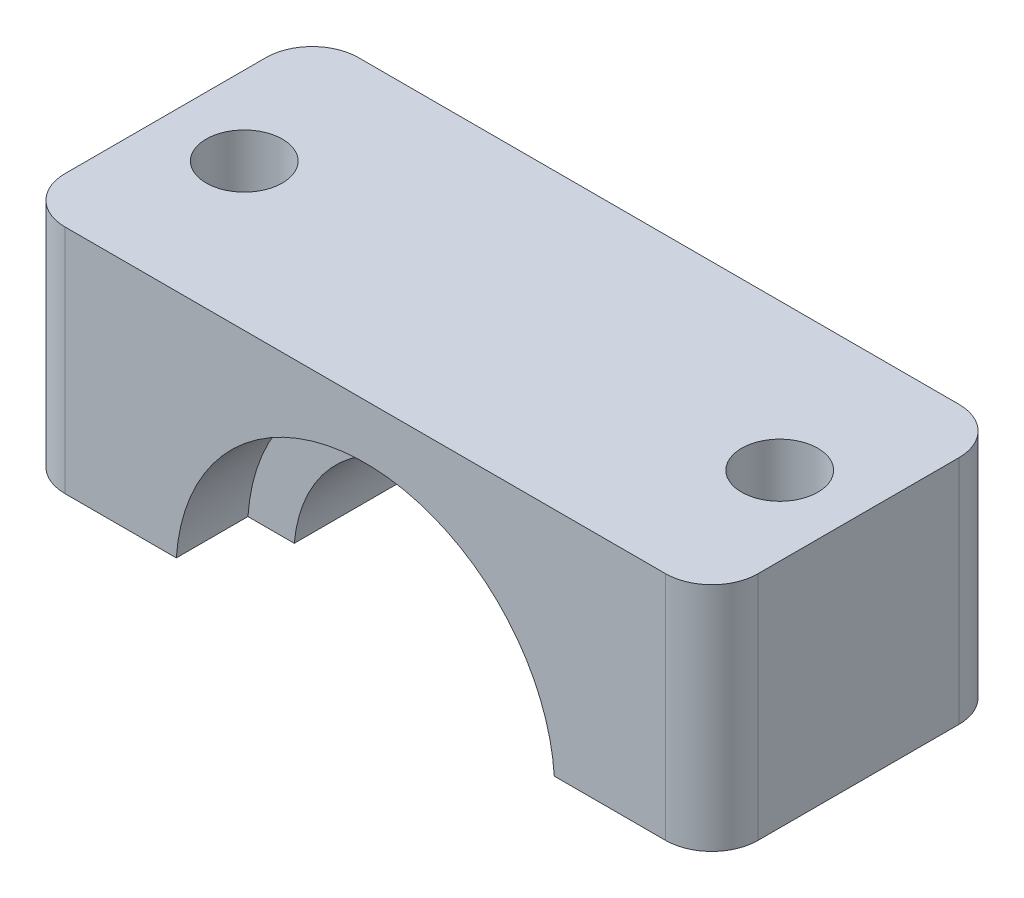
ISO-10303-21;
HEADER;
FILE_DESCRIPTION(('STEP AP214'),'2;1');
FILE_NAME('part.step','',(''),(''),'','','');
FILE_SCHEMA(('AUTOMOTIVE_DESIGN { 1 0 10303 214 1 1 1 1 }'));
ENDSEC;
DATA;
#1=APPLICATION_CONTEXT('core data for automotive mechanical design processes');
#2=APPLICATION_PROTOCOL_DEFINITION('international standard','automotive_design',2000,#1);
#3=PRODUCT_CONTEXT('',#1,'mechanical');
#4=PRODUCT('Part','Part','',(#3));
#5=PRODUCT_RELATED_PRODUCT_CATEGORY('part','',(#4));
#6=PRODUCT_DEFINITION_FORMATION('','',#4);
#7=PRODUCT_DEFINITION_CONTEXT('part definition',#1,'design');
#8=PRODUCT_DEFINITION('design','',#6,#7);
#9=PRODUCT_DEFINITION_SHAPE('','',#8);
#10=(LENGTH_UNIT() NAMED_UNIT(*) SI_UNIT(.MILLI.,.METRE.));
#11=(NAMED_UNIT(*) PLANE_ANGLE_UNIT() SI_UNIT($,.RADIAN.));
#12=(NAMED_UNIT(*) SI_UNIT($,.STERADIAN.) SOLID_ANGLE_UNIT());
#13=UNCERTAINTY_MEASURE_WITH_UNIT(LENGTH_MEASURE(1.E-05),#10,'distance_accuracy_value','');
#14=(GEOMETRIC_REPRESENTATION_CONTEXT(3) GLOBAL_UNCERTAINTY_ASSIGNED_CONTEXT((#13)) GLOBAL_UNIT_ASSIGNED_CONTEXT((#10,
#11,#12)) REPRESENTATION_CONTEXT('',''));
#15=CARTESIAN_POINT('',(0.,0.,0.));
#16=DIRECTION('',(0.,0.,1.));
#17=DIRECTION('',(1.,0.,0.));
#18=AXIS2_PLACEMENT_3D('',#15,#16,#17);
#19=CARTESIAN_POINT('',(0.,0.,0.));
#20=DIRECTION('',(0.,-1.,0.));
#21=DIRECTION('',(0.,0.,-1.));
#22=AXIS2_PLACEMENT_3D('',#19,#20,#21);
#23=PLANE('',#22);
#24=CARTESIAN_POINT('',(11.5907670429883,0.,0.));
#25=DIRECTION('',(0.,-1.,0.));
#26=DIRECTION('',(0.,0.,-1.));
#27=AXIS2_PLACEMENT_3D('',#24,#25,#26);
#28=CIRCLE('',#27,1.65);
#29=CARTESIAN_POINT('',(11.5907670429883,0.,-1.65));
#30=VERTEX_POINT('',#29);
#31=EDGE_CURVE('E314',#30,#30,#28,.F.);
#32=ORIENTED_EDGE('',*,*,#31,.T.);
#33=EDGE_LOOP('',(#32));
#34=FACE_BOUND('',#33,.T.);
#35=DIRECTION('',(-1.,0.,0.));
#36=VECTOR('',#35,1.);
#37=CARTESIAN_POINT('',(-15.,0.,-6.35));
#38=LINE('',#37,#36);
#39=CARTESIAN_POINT('',(13.,0.,-6.35));
#40=VERTEX_POINT('',#39);
#41=CARTESIAN_POINT('',(8.18153408597701,0.,-6.35));
#42=VERTEX_POINT('',#41);
#43=EDGE_CURVE('E214',#40,#42,#38,.T.);
#44=ORIENTED_EDGE('',*,*,#43,.F.);
#45=CARTESIAN_POINT('',(13.,0.,-4.35));
#46=DIRECTION('',(0.,-1.,0.));
#47=DIRECTION('',(0.,0.,-1.));
#48=AXIS2_PLACEMENT_3D('',#45,#46,#47);
#49=CIRCLE('',#48,2.);
#50=CARTESIAN_POINT('',(15.,0.,-4.35));
#51=VERTEX_POINT('',#50);
#52=EDGE_CURVE('E181',#40,#51,#49,.T.);
#53=ORIENTED_EDGE('',*,*,#52,.T.);
#54=DIRECTION('',(0.,0.,-1.));
#55=VECTOR('',#54,1.);
#56=CARTESIAN_POINT('',(15.,0.,6.35));
#57=LINE('',#56,#55);
#58=CARTESIAN_POINT('',(15.,0.,4.35));
#59=VERTEX_POINT('',#58);
#60=EDGE_CURVE('E241',#59,#51,#57,.T.);
#61=ORIENTED_EDGE('',*,*,#60,.F.);
#62=CARTESIAN_POINT('',(13.,0.,4.35));
#63=DIRECTION('',(0.,-1.,0.));
#64=DIRECTION('',(0.,0.,-1.));
#65=AXIS2_PLACEMENT_3D('',#62,#63,#64);
#66=CIRCLE('',#65,2.);
#67=CARTESIAN_POINT('',(13.,0.,6.35));
#68=VERTEX_POINT('',#67);
#69=EDGE_CURVE('E179',#59,#68,#66,.T.);
#70=ORIENTED_EDGE('',*,*,#69,.T.);
#71=DIRECTION('',(1.,0.,0.));
#72=VECTOR('',#71,1.);
#73=CARTESIAN_POINT('',(-15.,0.,6.35));
#74=LINE('',#73,#72);
#75=CARTESIAN_POINT('',(8.18153408597701,0.,6.35));
#76=VERTEX_POINT('',#75);
#77=EDGE_CURVE('E213',#76,#68,#74,.T.);
#78=ORIENTED_EDGE('',*,*,#77,.F.);
#79=DIRECTION('',(0.,0.,1.));
#80=VECTOR('',#79,1.);
#81=CARTESIAN_POINT('',(8.18153408597701,0.,3.25));
#82=LINE('',#81,#80);
#83=CARTESIAN_POINT('',(8.18153408597701,0.,3.25));
#84=VERTEX_POINT('',#83);
#85=EDGE_CURVE('E151',#84,#76,#82,.T.);
#86=ORIENTED_EDGE('',*,*,#85,.F.);
#87=DIRECTION('',(-1.,0.,0.));
#88=VECTOR('',#87,1.);
#89=CARTESIAN_POINT('',(0.,0.,3.25));
#90=LINE('',#89,#88);
#91=CARTESIAN_POINT('',(6.17555665507186,0.,3.25));
#92=VERTEX_POINT('',#91);
#93=EDGE_CURVE('E165',#84,#92,#90,.T.);
#94=ORIENTED_EDGE('',*,*,#93,.T.);
#95=DIRECTION('',(0.,0.,1.));
#96=VECTOR('',#95,1.);
#97=CARTESIAN_POINT('',(6.17555665507186,0.,-6.35));
#98=LINE('',#97,#96);
#99=CARTESIAN_POINT('',(6.17555665507186,0.,-2.55));
#100=VERTEX_POINT('',#99);
#101=EDGE_CURVE('E146',#100,#92,#98,.T.);
#102=ORIENTED_EDGE('',*,*,#101,.F.);
#103=DIRECTION('',(1.,0.,0.));
#104=VECTOR('',#103,1.);
#105=CARTESIAN_POINT('',(0.,0.,-2.55));
#106=LINE('',#105,#104);
#107=CARTESIAN_POINT('',(8.18153408597701,0.,-2.55));
#108=VERTEX_POINT('',#107);
#109=EDGE_CURVE('E224',#100,#108,#106,.T.);
#110=ORIENTED_EDGE('',*,*,#109,.T.);
#111=DIRECTION('',(0.,0.,-1.));
#112=VECTOR('',#111,1.);
#113=CARTESIAN_POINT('',(8.18153408597701,0.,-2.55));
#114=LINE('',#113,#112);
#115=EDGE_CURVE('E169',#42,#108,#114,.F.);
#116=ORIENTED_EDGE('',*,*,#115,.F.);
#117=EDGE_LOOP('',(#44,#53,#61,#70,#78,#86,#94,#102,#110,#116));
#118=FACE_BOUND('',#117,.T.);
#119=ADVANCED_FACE('F38',(#34,#118),#23,.T.);
#120=CARTESIAN_POINT('',(15.,10.,6.35));
#121=DIRECTION('',(-1.,0.,0.));
#122=DIRECTION('',(0.,0.,1.));
#123=AXIS2_PLACEMENT_3D('',#120,#121,#122);
#124=PLANE('',#123);
#125=ORIENTED_EDGE('',*,*,#60,.T.);
#126=DIRECTION('',(0.,-1.,0.));
#127=VECTOR('',#126,1.);
#128=CARTESIAN_POINT('',(15.,10.,-4.35));
#129=LINE('',#128,#127);
#130=CARTESIAN_POINT('',(15.,10.,-4.35));
#131=VERTEX_POINT('',#130);
#132=EDGE_CURVE('E186',#51,#131,#129,.F.);
#133=ORIENTED_EDGE('',*,*,#132,.T.);
#134=DIRECTION('',(0.,0.,-1.));
#135=VECTOR('',#134,1.);
#136=CARTESIAN_POINT('',(15.,10.,6.35));
#137=LINE('',#136,#135);
#138=CARTESIAN_POINT('',(15.,10.,4.35));
#139=VERTEX_POINT('',#138);
#140=EDGE_CURVE('E223',#139,#131,#137,.T.);
#141=ORIENTED_EDGE('',*,*,#140,.F.);
#142=DIRECTION('',(0.,-1.,0.));
#143=VECTOR('',#142,1.);
#144=CARTESIAN_POINT('',(15.,10.,4.35));
#145=LINE('',#144,#143);
#146=EDGE_CURVE('E183',#139,#59,#145,.T.);
#147=ORIENTED_EDGE('',*,*,#146,.T.);
#148=EDGE_LOOP('',(#125,#133,#141,#147));
#149=FACE_BOUND('',#148,.T.);
#150=ADVANCED_FACE('F270',(#149),#124,.F.);
#151=CARTESIAN_POINT('',(-15.,10.,-6.35));
#152=DIRECTION('',(0.,0.,1.));
#153=DIRECTION('',(1.,0.,0.));
#154=AXIS2_PLACEMENT_3D('',#151,#152,#153);
#155=PLANE('',#154);
#156=DIRECTION('',(-1.,0.,0.));
#157=VECTOR('',#156,1.);
#158=CARTESIAN_POINT('',(-15.,10.,-6.35));
#159=LINE('',#158,#157);
#160=CARTESIAN_POINT('',(13.,10.,-6.35));
#161=VERTEX_POINT('',#160);
#162=CARTESIAN_POINT('',(-13.,10.,-6.35));
#163=VERTEX_POINT('',#162);
#164=EDGE_CURVE('E251',#161,#163,#159,.T.);
#165=ORIENTED_EDGE('',*,*,#164,.F.);
#166=DIRECTION('',(0.,-1.,0.));
#167=VECTOR('',#166,1.);
#168=CARTESIAN_POINT('',(13.,10.,-6.35));
#169=LINE('',#168,#167);
#170=EDGE_CURVE('E176',#161,#40,#169,.T.);
#171=ORIENTED_EDGE('',*,*,#170,.T.);
#172=ORIENTED_EDGE('',*,*,#43,.T.);
#173=CARTESIAN_POINT('',(2.23779328401008E-13,-0.550000000000023,-6.35));
#174=DIRECTION('',(0.,0.,-1.));
#175=DIRECTION('',(-1.,0.,0.));
#176=AXIS2_PLACEMENT_3D('',#173,#174,#175);
#177=CIRCLE('',#176,8.2);
#178=CARTESIAN_POINT('',(-8.18153408597656,0.,-6.35));
#179=VERTEX_POINT('',#178);
#180=EDGE_CURVE('E234',#179,#42,#177,.T.);
#181=ORIENTED_EDGE('',*,*,#180,.F.);
#182=CARTESIAN_POINT('',(-13.,0.,-6.35));
#183=VERTEX_POINT('',#182);
#184=EDGE_CURVE('E219',#179,#183,#38,.T.);
#185=ORIENTED_EDGE('',*,*,#184,.T.);
#186=DIRECTION('',(0.,-1.,0.));
#187=VECTOR('',#186,1.);
#188=CARTESIAN_POINT('',(-13.,10.,-6.35));
#189=LINE('',#188,#187);
#190=EDGE_CURVE('E150',#183,#163,#189,.F.);
#191=ORIENTED_EDGE('',*,*,#190,.T.);
#192=EDGE_LOOP('',(#165,#171,#172,#181,#185,#191));
#193=FACE_BOUND('',#192,.T.);
#194=ADVANCED_FACE('F279',(#193),#155,.F.);
#195=CARTESIAN_POINT('',(-15.,10.,6.35));
#196=DIRECTION('',(1.,0.,0.));
#197=DIRECTION('',(0.,0.,-1.));
#198=AXIS2_PLACEMENT_3D('',#195,#196,#197);
#199=PLANE('',#198);
#200=DIRECTION('',(0.,0.,1.));
#201=VECTOR('',#200,1.);
#202=CARTESIAN_POINT('',(-15.,0.,6.35));
#203=LINE('',#202,#201);
#204=CARTESIAN_POINT('',(-15.,0.,-4.35));
#205=VERTEX_POINT('',#204);
#206=CARTESIAN_POINT('',(-15.,0.,4.35));
#207=VERTEX_POINT('',#206);
#208=EDGE_CURVE('E206',#205,#207,#203,.T.);
#209=ORIENTED_EDGE('',*,*,#208,.T.);
#210=DIRECTION('',(0.,-1.,0.));
#211=VECTOR('',#210,1.);
#212=CARTESIAN_POINT('',(-15.,10.,4.35));
#213=LINE('',#212,#211);
#214=CARTESIAN_POINT('',(-15.,10.,4.35));
#215=VERTEX_POINT('',#214);
#216=EDGE_CURVE('E11',#207,#215,#213,.F.);
#217=ORIENTED_EDGE('',*,*,#216,.T.);
#218=DIRECTION('',(0.,0.,1.));
#219=VECTOR('',#218,1.);
#220=CARTESIAN_POINT('',(-15.,10.,6.35));
#221=LINE('',#220,#219);
#222=CARTESIAN_POINT('',(-15.,10.,-4.35));
#223=VERTEX_POINT('',#222);
#224=EDGE_CURVE('E209',#223,#215,#221,.T.);
#225=ORIENTED_EDGE('',*,*,#224,.F.);
#226=DIRECTION('',(0.,-1.,0.));
#227=VECTOR('',#226,1.);
#228=CARTESIAN_POINT('',(-15.,10.,-4.35));
#229=LINE('',#228,#227);
#230=EDGE_CURVE('E47',#223,#205,#229,.T.);
#231=ORIENTED_EDGE('',*,*,#230,.T.);
#232=EDGE_LOOP('',(#209,#217,#225,#231));
#233=FACE_BOUND('',#232,.T.);
#234=ADVANCED_FACE('F205',(#233),#199,.F.);
#235=CARTESIAN_POINT('',(-15.,10.,6.35));
#236=DIRECTION('',(0.,0.,-1.));
#237=DIRECTION('',(-1.,0.,0.));
#238=AXIS2_PLACEMENT_3D('',#235,#236,#237);
#239=PLANE('',#238);
#240=ORIENTED_EDGE('',*,*,#77,.T.);
#241=DIRECTION('',(0.,-1.,0.));
#242=VECTOR('',#241,1.);
#243=CARTESIAN_POINT('',(13.,10.,6.35));
#244=LINE('',#243,#242);
#245=CARTESIAN_POINT('',(13.,10.,6.35));
#246=VERTEX_POINT('',#245);
#247=EDGE_CURVE('E199',#68,#246,#244,.F.);
#248=ORIENTED_EDGE('',*,*,#247,.T.);
#249=DIRECTION('',(1.,0.,0.));
#250=VECTOR('',#249,1.);
#251=CARTESIAN_POINT('',(-15.,10.,6.35));
#252=LINE('',#251,#250);
#253=CARTESIAN_POINT('',(-13.,10.,6.35));
#254=VERTEX_POINT('',#253);
#255=EDGE_CURVE('E239',#254,#246,#252,.T.);
#256=ORIENTED_EDGE('',*,*,#255,.F.);
#257=DIRECTION('',(0.,-1.,0.));
#258=VECTOR('',#257,1.);
#259=CARTESIAN_POINT('',(-13.,10.,6.35));
#260=LINE('',#259,#258);
#261=CARTESIAN_POINT('',(-13.,0.,6.35));
#262=VERTEX_POINT('',#261);
#263=EDGE_CURVE('E196',#254,#262,#260,.T.);
#264=ORIENTED_EDGE('',*,*,#263,.T.);
#265=CARTESIAN_POINT('',(-8.18153408597656,0.,6.35));
#266=VERTEX_POINT('',#265);
#267=EDGE_CURVE('E217',#262,#266,#74,.T.);
#268=ORIENTED_EDGE('',*,*,#267,.T.);
#269=CARTESIAN_POINT('',(2.23779328401008E-13,-0.550000000000023,6.35));
#270=DIRECTION('',(0.,0.,1.));
#271=DIRECTION('',(1.,0.,0.));
#272=AXIS2_PLACEMENT_3D('',#269,#270,#271);
#273=CIRCLE('',#272,8.2);
#274=EDGE_CURVE('E246',#76,#266,#273,.T.);
#275=ORIENTED_EDGE('',*,*,#274,.F.);
#276=EDGE_LOOP('',(#240,#248,#256,#264,#268,#275));
#277=FACE_BOUND('',#276,.T.);
#278=ADVANCED_FACE('F308',(#277),#239,.F.);
#279=CARTESIAN_POINT('',(0.,10.,0.));
#280=DIRECTION('',(0.,-1.,0.));
#281=DIRECTION('',(0.,0.,-1.));
#282=AXIS2_PLACEMENT_3D('',#279,#280,#281);
#283=PLANE('',#282);
#284=CARTESIAN_POINT('',(11.5907670429883,10.,0.));
#285=DIRECTION('',(0.,1.,0.));
#286=DIRECTION('',(0.,0.,-1.));
#287=AXIS2_PLACEMENT_3D('',#284,#285,#286);
#288=CIRCLE('',#287,1.65);
#289=CARTESIAN_POINT('',(11.5907670429883,10.,-1.65));
#290=VERTEX_POINT('',#289);
#291=EDGE_CURVE('E318',#290,#290,#288,.T.);
#292=ORIENTED_EDGE('',*,*,#291,.F.);
#293=EDGE_LOOP('',(#292));
#294=FACE_BOUND('',#293,.T.);
#295=CARTESIAN_POINT('',(-11.5907670429883,10.,0.));
#296=DIRECTION('',(0.,-1.,0.));
#297=DIRECTION('',(0.,0.,-1.));
#298=AXIS2_PLACEMENT_3D('',#295,#296,#297);
#299=CIRCLE('',#298,1.65);
#300=CARTESIAN_POINT('',(-11.5907670429883,10.,-1.65));
#301=VERTEX_POINT('',#300);
#302=EDGE_CURVE('E312',#301,#301,#299,.T.);
#303=ORIENTED_EDGE('',*,*,#302,.T.);
#304=EDGE_LOOP('',(#303));
#305=FACE_BOUND('',#304,.T.);
#306=ORIENTED_EDGE('',*,*,#140,.T.);
#307=CARTESIAN_POINT('',(13.,10.,-4.35));
#308=DIRECTION('',(0.,-1.,0.));
#309=DIRECTION('',(0.,0.,-1.));
#310=AXIS2_PLACEMENT_3D('',#307,#308,#309);
#311=CIRCLE('',#310,2.);
#312=EDGE_CURVE('E194',#131,#161,#311,.F.);
#313=ORIENTED_EDGE('',*,*,#312,.T.);
#314=ORIENTED_EDGE('',*,*,#164,.T.);
#315=CARTESIAN_POINT('',(-13.,10.,-4.35));
#316=DIRECTION('',(0.,-1.,0.));
#317=DIRECTION('',(0.,0.,-1.));
#318=AXIS2_PLACEMENT_3D('',#315,#316,#317);
#319=CIRCLE('',#318,2.);
#320=EDGE_CURVE('E188',#163,#223,#319,.F.);
#321=ORIENTED_EDGE('',*,*,#320,.T.);
#322=ORIENTED_EDGE('',*,*,#224,.T.);
#323=CARTESIAN_POINT('',(-13.,10.,4.35));
#324=DIRECTION('',(0.,-1.,0.));
#325=DIRECTION('',(0.,0.,-1.));
#326=AXIS2_PLACEMENT_3D('',#323,#324,#325);
#327=CIRCLE('',#326,2.);
#328=EDGE_CURVE('E190',#215,#254,#327,.F.);
#329=ORIENTED_EDGE('',*,*,#328,.T.);
#330=ORIENTED_EDGE('',*,*,#255,.T.);
#331=CARTESIAN_POINT('',(13.,10.,4.35));
#332=DIRECTION('',(0.,-1.,0.));
#333=DIRECTION('',(0.,0.,-1.));
#334=AXIS2_PLACEMENT_3D('',#331,#332,#333);
#335=CIRCLE('',#334,2.);
#336=EDGE_CURVE('E192',#246,#139,#335,.F.);
#337=ORIENTED_EDGE('',*,*,#336,.T.);
#338=EDGE_LOOP('',(#306,#313,#314,#321,#322,#329,#330,#337));
#339=FACE_BOUND('',#338,.T.);
#340=ADVANCED_FACE('F259',(#294,#305,#339),#283,.F.);
#341=CARTESIAN_POINT('',(-11.5907670429883,0.,0.));
#342=DIRECTION('',(0.,-1.,0.));
#343=DIRECTION('',(0.,0.,-1.));
#344=AXIS2_PLACEMENT_3D('',#341,#342,#343);
#345=CIRCLE('',#344,1.65);
#346=CARTESIAN_POINT('',(-11.5907670429883,0.,-1.65));
#347=VERTEX_POINT('',#346);
#348=EDGE_CURVE('E42',#347,#347,#345,.T.);
#349=ORIENTED_EDGE('',*,*,#348,.F.);
#350=EDGE_LOOP('',(#349));
#351=FACE_BOUND('',#350,.T.);
#352=ORIENTED_EDGE('',*,*,#267,.F.);
#353=CARTESIAN_POINT('',(-13.,0.,4.35));
#354=DIRECTION('',(0.,-1.,0.));
#355=DIRECTION('',(0.,0.,-1.));
#356=AXIS2_PLACEMENT_3D('',#353,#354,#355);
#357=CIRCLE('',#356,2.);
#358=EDGE_CURVE('E54',#262,#207,#357,.T.);
#359=ORIENTED_EDGE('',*,*,#358,.T.);
#360=ORIENTED_EDGE('',*,*,#208,.F.);
#361=CARTESIAN_POINT('',(-13.,0.,-4.35));
#362=DIRECTION('',(0.,-1.,0.));
#363=DIRECTION('',(0.,0.,-1.));
#364=AXIS2_PLACEMENT_3D('',#361,#362,#363);
#365=CIRCLE('',#364,2.);
#366=EDGE_CURVE('E62',#205,#183,#365,.T.);
#367=ORIENTED_EDGE('',*,*,#366,.T.);
#368=ORIENTED_EDGE('',*,*,#184,.F.);
#369=DIRECTION('',(0.,0.,-1.));
#370=VECTOR('',#369,1.);
#371=CARTESIAN_POINT('',(-8.18153408597656,0.,-2.55));
#372=LINE('',#371,#370);
#373=CARTESIAN_POINT('',(-8.18153408597656,0.,-2.55));
#374=VERTEX_POINT('',#373);
#375=EDGE_CURVE('E166',#374,#179,#372,.T.);
#376=ORIENTED_EDGE('',*,*,#375,.F.);
#377=CARTESIAN_POINT('',(-6.17555665507148,0.,-2.55));
#378=VERTEX_POINT('',#377);
#379=EDGE_CURVE('E159',#374,#378,#106,.T.);
#380=ORIENTED_EDGE('',*,*,#379,.T.);
#381=DIRECTION('',(0.,0.,1.));
#382=VECTOR('',#381,1.);
#383=CARTESIAN_POINT('',(-6.17555665507148,0.,-6.35));
#384=LINE('',#383,#382);
#385=CARTESIAN_POINT('',(-6.17555665507148,0.,3.25));
#386=VERTEX_POINT('',#385);
#387=EDGE_CURVE('E143',#386,#378,#384,.F.);
#388=ORIENTED_EDGE('',*,*,#387,.F.);
#389=CARTESIAN_POINT('',(-8.18153408597656,0.,3.25));
#390=VERTEX_POINT('',#389);
#391=EDGE_CURVE('E156',#386,#390,#90,.T.);
#392=ORIENTED_EDGE('',*,*,#391,.T.);
#393=DIRECTION('',(0.,0.,1.));
#394=VECTOR('',#393,1.);
#395=CARTESIAN_POINT('',(-8.18153408597656,0.,3.25));
#396=LINE('',#395,#394);
#397=EDGE_CURVE('E168',#266,#390,#396,.F.);
#398=ORIENTED_EDGE('',*,*,#397,.F.);
#399=EDGE_LOOP('',(#352,#359,#360,#367,#368,#376,#380,#388,#392,#398));
#400=FACE_BOUND('',#399,.T.);
#401=ADVANCED_FACE('F154',(#351,#400),#23,.T.);
#402=CARTESIAN_POINT('',(2.23779328401008E-13,-0.550000000000023,-2.55));
#403=DIRECTION('',(0.,0.,-1.));
#404=DIRECTION('',(-1.,0.,0.));
#405=AXIS2_PLACEMENT_3D('',#402,#403,#404);
#406=CYLINDRICAL_SURFACE('',#405,8.2);
#407=ORIENTED_EDGE('',*,*,#375,.T.);
#408=ORIENTED_EDGE('',*,*,#180,.T.);
#409=ORIENTED_EDGE('',*,*,#115,.T.);
#410=CARTESIAN_POINT('',(2.23779328401008E-13,-0.550000000000023,-2.55));
#411=DIRECTION('',(0.,0.,-1.));
#412=DIRECTION('',(-1.,0.,0.));
#413=AXIS2_PLACEMENT_3D('',#410,#411,#412);
#414=CIRCLE('',#413,8.2);
#415=EDGE_CURVE('E232',#374,#108,#414,.T.);
#416=ORIENTED_EDGE('',*,*,#415,.F.);
#417=EDGE_LOOP('',(#407,#408,#409,#416));
#418=FACE_BOUND('',#417,.T.);
#419=ADVANCED_FACE('F230',(#418),#406,.F.);
#420=CARTESIAN_POINT('',(2.23779328401008E-13,-0.550000000000023,-2.55));
#421=DIRECTION('',(0.,0.,-1.));
#422=DIRECTION('',(-1.,0.,0.));
#423=AXIS2_PLACEMENT_3D('',#420,#421,#422);
#424=PLANE('',#423);
#425=CARTESIAN_POINT('',(1.8995222061946E-13,-0.550000000000002,-2.55));
#426=DIRECTION('',(0.,0.,-1.));
#427=DIRECTION('',(-1.,0.,0.));
#428=AXIS2_PLACEMENT_3D('',#425,#426,#427);
#429=CIRCLE('',#428,6.2);
#430=EDGE_CURVE('E323',#378,#100,#429,.T.);
#431=ORIENTED_EDGE('',*,*,#430,.F.);
#432=ORIENTED_EDGE('',*,*,#379,.F.);
#433=ORIENTED_EDGE('',*,*,#415,.T.);
#434=ORIENTED_EDGE('',*,*,#109,.F.);
#435=EDGE_LOOP('',(#431,#432,#433,#434));
#436=FACE_BOUND('',#435,.T.);
#437=ADVANCED_FACE('F240',(#436),#424,.T.);
#438=CARTESIAN_POINT('',(2.23779328401008E-13,-0.550000000000023,3.25));
#439=DIRECTION('',(0.,0.,1.));
#440=DIRECTION('',(1.,0.,0.));
#441=AXIS2_PLACEMENT_3D('',#438,#439,#440);
#442=CYLINDRICAL_SURFACE('',#441,8.2);
#443=ORIENTED_EDGE('',*,*,#85,.T.);
#444=ORIENTED_EDGE('',*,*,#274,.T.);
#445=ORIENTED_EDGE('',*,*,#397,.T.);
#446=CARTESIAN_POINT('',(2.23779328401008E-13,-0.550000000000023,3.25));
#447=DIRECTION('',(0.,0.,1.));
#448=DIRECTION('',(1.,0.,0.));
#449=AXIS2_PLACEMENT_3D('',#446,#447,#448);
#450=CIRCLE('',#449,8.2);
#451=EDGE_CURVE('E163',#84,#390,#450,.T.);
#452=ORIENTED_EDGE('',*,*,#451,.F.);
#453=EDGE_LOOP('',(#443,#444,#445,#452));
#454=FACE_BOUND('',#453,.T.);
#455=ADVANCED_FACE('F327',(#454),#442,.F.);
#456=CARTESIAN_POINT('',(2.23779328401008E-13,-0.550000000000023,3.25));
#457=DIRECTION('',(0.,0.,1.));
#458=DIRECTION('',(1.,0.,0.));
#459=AXIS2_PLACEMENT_3D('',#456,#457,#458);
#460=PLANE('',#459);
#461=CARTESIAN_POINT('',(1.8995222061946E-13,-0.550000000000002,3.25));
#462=DIRECTION('',(0.,0.,1.));
#463=DIRECTION('',(1.,0.,0.));
#464=AXIS2_PLACEMENT_3D('',#461,#462,#463);
#465=CIRCLE('',#464,6.2);
#466=EDGE_CURVE('E140',#92,#386,#465,.T.);
#467=ORIENTED_EDGE('',*,*,#466,.F.);
#468=ORIENTED_EDGE('',*,*,#93,.F.);
#469=ORIENTED_EDGE('',*,*,#451,.T.);
#470=ORIENTED_EDGE('',*,*,#391,.F.);
#471=EDGE_LOOP('',(#467,#468,#469,#470));
#472=FACE_BOUND('',#471,.T.);
#473=ADVANCED_FACE('F161',(#472),#460,.T.);
#474=CARTESIAN_POINT('',(1.8995222061946E-13,-0.550000000000002,-6.35));
#475=DIRECTION('',(0.,0.,1.));
#476=DIRECTION('',(1.,0.,0.));
#477=AXIS2_PLACEMENT_3D('',#474,#475,#476);
#478=CYLINDRICAL_SURFACE('',#477,6.2);
#479=ORIENTED_EDGE('',*,*,#430,.T.);
#480=ORIENTED_EDGE('',*,*,#101,.T.);
#481=ORIENTED_EDGE('',*,*,#466,.T.);
#482=ORIENTED_EDGE('',*,*,#387,.T.);
#483=EDGE_LOOP('',(#479,#480,#481,#482));
#484=FACE_BOUND('',#483,.T.);
#485=ADVANCED_FACE('F142',(#484),#478,.F.);
#486=CARTESIAN_POINT('',(13.,10.,-4.35));
#487=DIRECTION('',(0.,-1.,0.));
#488=DIRECTION('',(0.,0.,-1.));
#489=AXIS2_PLACEMENT_3D('',#486,#487,#488);
#490=CYLINDRICAL_SURFACE('',#489,2.);
#491=ORIENTED_EDGE('',*,*,#312,.F.);
#492=ORIENTED_EDGE('',*,*,#132,.F.);
#493=ORIENTED_EDGE('',*,*,#52,.F.);
#494=ORIENTED_EDGE('',*,*,#170,.F.);
#495=EDGE_LOOP('',(#491,#492,#493,#494));
#496=FACE_BOUND('',#495,.T.);
#497=ADVANCED_FACE('F276',(#496),#490,.T.);
#498=CARTESIAN_POINT('',(13.,10.,4.35));
#499=DIRECTION('',(0.,-1.,0.));
#500=DIRECTION('',(0.,0.,-1.));
#501=AXIS2_PLACEMENT_3D('',#498,#499,#500);
#502=CYLINDRICAL_SURFACE('',#501,2.);
#503=ORIENTED_EDGE('',*,*,#336,.F.);
#504=ORIENTED_EDGE('',*,*,#247,.F.);
#505=ORIENTED_EDGE('',*,*,#69,.F.);
#506=ORIENTED_EDGE('',*,*,#146,.F.);
#507=EDGE_LOOP('',(#503,#504,#505,#506));
#508=FACE_BOUND('',#507,.T.);
#509=ADVANCED_FACE('F267',(#508),#502,.T.);
#510=CARTESIAN_POINT('',(-13.,10.,4.35));
#511=DIRECTION('',(0.,-1.,0.));
#512=DIRECTION('',(0.,0.,-1.));
#513=AXIS2_PLACEMENT_3D('',#510,#511,#512);
#514=CYLINDRICAL_SURFACE('',#513,2.);
#515=ORIENTED_EDGE('',*,*,#328,.F.);
#516=ORIENTED_EDGE('',*,*,#216,.F.);
#517=ORIENTED_EDGE('',*,*,#358,.F.);
#518=ORIENTED_EDGE('',*,*,#263,.F.);
#519=EDGE_LOOP('',(#515,#516,#517,#518));
#520=FACE_BOUND('',#519,.T.);
#521=ADVANCED_FACE('F282',(#520),#514,.T.);
#522=CARTESIAN_POINT('',(-13.,10.,-4.35));
#523=DIRECTION('',(0.,-1.,0.));
#524=DIRECTION('',(0.,0.,-1.));
#525=AXIS2_PLACEMENT_3D('',#522,#523,#524);
#526=CYLINDRICAL_SURFACE('',#525,2.);
#527=ORIENTED_EDGE('',*,*,#320,.F.);
#528=ORIENTED_EDGE('',*,*,#190,.F.);
#529=ORIENTED_EDGE('',*,*,#366,.F.);
#530=ORIENTED_EDGE('',*,*,#230,.F.);
#531=EDGE_LOOP('',(#527,#528,#529,#530));
#532=FACE_BOUND('',#531,.T.);
#533=ADVANCED_FACE('F40',(#532),#526,.T.);
#534=CARTESIAN_POINT('',(-11.5907670429883,10.,0.));
#535=DIRECTION('',(0.,-1.,0.));
#536=DIRECTION('',(0.,0.,-1.));
#537=AXIS2_PLACEMENT_3D('',#534,#535,#536);
#538=CYLINDRICAL_SURFACE('',#537,1.65);
#539=ORIENTED_EDGE('',*,*,#348,.T.);
#540=EDGE_LOOP('',(#539));
#541=FACE_BOUND('',#540,.T.);
#542=ORIENTED_EDGE('',*,*,#302,.F.);
#543=EDGE_LOOP('',(#542));
#544=FACE_BOUND('',#543,.T.);
#545=ADVANCED_FACE('F281',(#541,#544),#538,.F.);
#546=CARTESIAN_POINT('',(11.5907670429883,10.,0.));
#547=DIRECTION('',(0.,-1.,0.));
#548=DIRECTION('',(0.,0.,-1.));
#549=AXIS2_PLACEMENT_3D('',#546,#547,#548);
#550=CYLINDRICAL_SURFACE('',#549,1.65);
#551=ORIENTED_EDGE('',*,*,#31,.F.);
#552=EDGE_LOOP('',(#551));
#553=FACE_BOUND('',#552,.T.);
#554=ORIENTED_EDGE('',*,*,#291,.T.);
#555=EDGE_LOOP('',(#554));
#556=FACE_BOUND('',#555,.T.);
#557=ADVANCED_FACE('F287',(#553,#556),#550,.F.);
#558=CLOSED_SHELL('',(#119,#150,#194,#234,#278,#340,#401,#419,#437,#455,#473,#485,#497,#509,
#521,#533,#545,#557));
#559=MANIFOLD_SOLID_BREP('B2',#558);
#560=ADVANCED_BREP_SHAPE_REPRESENTATION('',(#18,#559),#14);
#561=SHAPE_DEFINITION_REPRESENTATION(#9,#560);
ENDSEC;
END-ISO-10303-21;
